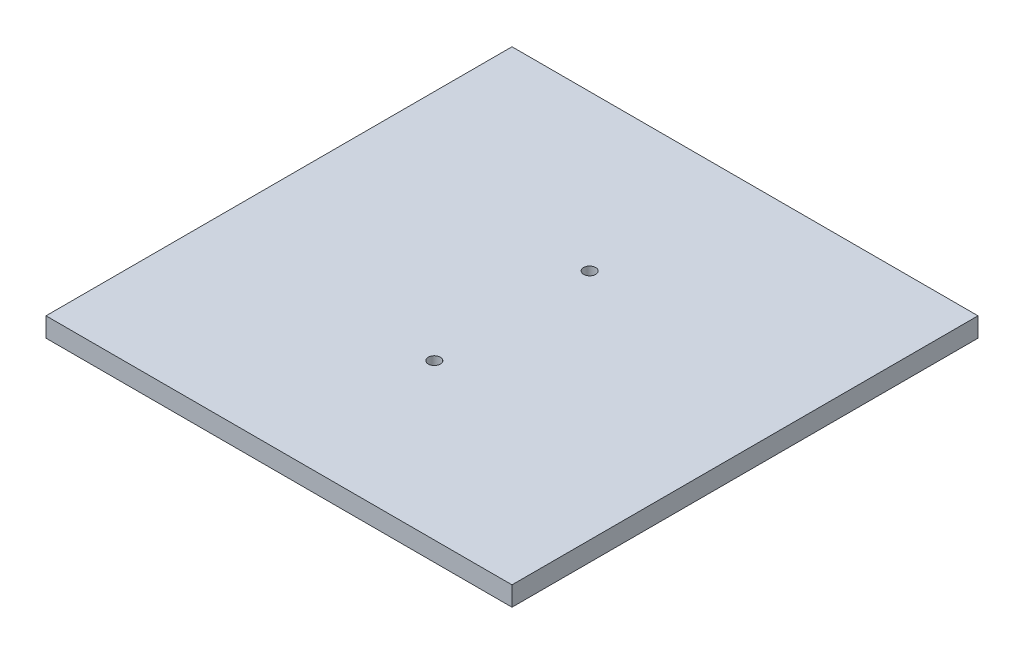
ISO-10303-21;
HEADER;
FILE_DESCRIPTION(('STEP AP214'),'2;1');
FILE_NAME('part.step','',(''),(''),'','','');
FILE_SCHEMA(('AUTOMOTIVE_DESIGN { 1 0 10303 214 1 1 1 1 }'));
ENDSEC;
DATA;
#1=APPLICATION_CONTEXT('core data for automotive mechanical design processes');
#2=APPLICATION_PROTOCOL_DEFINITION('international standard','automotive_design',2000,#1);
#3=PRODUCT_CONTEXT('',#1,'mechanical');
#4=PRODUCT('Part','Part','',(#3));
#5=PRODUCT_RELATED_PRODUCT_CATEGORY('part','',(#4));
#6=PRODUCT_DEFINITION_FORMATION('','',#4);
#7=PRODUCT_DEFINITION_CONTEXT('part definition',#1,'design');
#8=PRODUCT_DEFINITION('design','',#6,#7);
#9=PRODUCT_DEFINITION_SHAPE('','',#8);
#10=(LENGTH_UNIT() NAMED_UNIT(*) SI_UNIT(.MILLI.,.METRE.));
#11=(NAMED_UNIT(*) PLANE_ANGLE_UNIT() SI_UNIT($,.RADIAN.));
#12=(NAMED_UNIT(*) SI_UNIT($,.STERADIAN.) SOLID_ANGLE_UNIT());
#13=UNCERTAINTY_MEASURE_WITH_UNIT(LENGTH_MEASURE(1.E-05),#10,'distance_accuracy_value','');
#14=(GEOMETRIC_REPRESENTATION_CONTEXT(3) GLOBAL_UNCERTAINTY_ASSIGNED_CONTEXT((#13)) GLOBAL_UNIT_ASSIGNED_CONTEXT((#10,
#11,#12)) REPRESENTATION_CONTEXT('',''));
#15=CARTESIAN_POINT('',(0.,0.,0.));
#16=DIRECTION('',(0.,0.,1.));
#17=DIRECTION('',(1.,0.,0.));
#18=AXIS2_PLACEMENT_3D('',#15,#16,#17);
#19=CARTESIAN_POINT('',(-47.6798143851508,5.,40.2320185614849));
#20=DIRECTION('',(1.,0.,0.));
#21=DIRECTION('',(0.,0.,-1.));
#22=AXIS2_PLACEMENT_3D('',#19,#20,#21);
#23=PLANE('',#22);
#24=DIRECTION('',(0.,0.,1.));
#25=VECTOR('',#24,1.);
#26=CARTESIAN_POINT('',(-47.6798143851508,0.,40.2320185614849));
#27=LINE('',#26,#25);
#28=CARTESIAN_POINT('',(-47.6798143851508,0.,-79.7679814385151));
#29=VERTEX_POINT('',#28);
#30=CARTESIAN_POINT('',(-47.6798143851508,0.,40.2320185614849));
#31=VERTEX_POINT('',#30);
#32=EDGE_CURVE('E107',#29,#31,#27,.T.);
#33=ORIENTED_EDGE('',*,*,#32,.T.);
#34=DIRECTION('',(0.,-1.,0.));
#35=VECTOR('',#34,1.);
#36=CARTESIAN_POINT('',(-47.6798143851508,5.,40.2320185614849));
#37=LINE('',#36,#35);
#38=CARTESIAN_POINT('',(-47.6798143851508,5.,40.2320185614849));
#39=VERTEX_POINT('',#38);
#40=EDGE_CURVE('E11',#39,#31,#37,.T.);
#41=ORIENTED_EDGE('',*,*,#40,.F.);
#42=DIRECTION('',(0.,0.,1.));
#43=VECTOR('',#42,1.);
#44=CARTESIAN_POINT('',(-47.6798143851508,5.,40.2320185614849));
#45=LINE('',#44,#43);
#46=CARTESIAN_POINT('',(-47.6798143851508,5.,-79.7679814385151));
#47=VERTEX_POINT('',#46);
#48=EDGE_CURVE('E91',#47,#39,#45,.T.);
#49=ORIENTED_EDGE('',*,*,#48,.F.);
#50=DIRECTION('',(0.,-1.,0.));
#51=VECTOR('',#50,1.);
#52=CARTESIAN_POINT('',(-47.6798143851508,5.,-79.7679814385151));
#53=LINE('',#52,#51);
#54=EDGE_CURVE('E103',#47,#29,#53,.T.);
#55=ORIENTED_EDGE('',*,*,#54,.T.);
#56=EDGE_LOOP('',(#33,#41,#49,#55));
#57=FACE_BOUND('',#56,.T.);
#58=ADVANCED_FACE('F39',(#57),#23,.F.);
#59=CARTESIAN_POINT('',(-47.6798143851508,5.,40.2320185614849));
#60=DIRECTION('',(0.,0.,-1.));
#61=DIRECTION('',(-1.,0.,0.));
#62=AXIS2_PLACEMENT_3D('',#59,#60,#61);
#63=PLANE('',#62);
#64=DIRECTION('',(1.,0.,0.));
#65=VECTOR('',#64,1.);
#66=CARTESIAN_POINT('',(-47.6798143851508,0.,40.2320185614849));
#67=LINE('',#66,#65);
#68=CARTESIAN_POINT('',(72.3201856148492,0.,40.2320185614849));
#69=VERTEX_POINT('',#68);
#70=EDGE_CURVE('E96',#31,#69,#67,.T.);
#71=ORIENTED_EDGE('',*,*,#70,.T.);
#72=DIRECTION('',(0.,-1.,0.));
#73=VECTOR('',#72,1.);
#74=CARTESIAN_POINT('',(72.3201856148492,5.,40.2320185614849));
#75=LINE('',#74,#73);
#76=CARTESIAN_POINT('',(72.3201856148492,5.,40.2320185614849));
#77=VERTEX_POINT('',#76);
#78=EDGE_CURVE('E48',#77,#69,#75,.T.);
#79=ORIENTED_EDGE('',*,*,#78,.F.);
#80=DIRECTION('',(1.,0.,0.));
#81=VECTOR('',#80,1.);
#82=CARTESIAN_POINT('',(-47.6798143851508,5.,40.2320185614849));
#83=LINE('',#82,#81);
#84=EDGE_CURVE('E86',#39,#77,#83,.T.);
#85=ORIENTED_EDGE('',*,*,#84,.F.);
#86=ORIENTED_EDGE('',*,*,#40,.T.);
#87=EDGE_LOOP('',(#71,#79,#85,#86));
#88=FACE_BOUND('',#87,.T.);
#89=ADVANCED_FACE('F95',(#88),#63,.F.);
#90=CARTESIAN_POINT('',(72.3201856148492,5.,40.2320185614849));
#91=DIRECTION('',(-1.,0.,0.));
#92=DIRECTION('',(0.,0.,1.));
#93=AXIS2_PLACEMENT_3D('',#90,#91,#92);
#94=PLANE('',#93);
#95=DIRECTION('',(0.,0.,-1.));
#96=VECTOR('',#95,1.);
#97=CARTESIAN_POINT('',(72.3201856148492,0.,40.2320185614849));
#98=LINE('',#97,#96);
#99=CARTESIAN_POINT('',(72.3201856148492,0.,-79.7679814385151));
#100=VERTEX_POINT('',#99);
#101=EDGE_CURVE('E73',#69,#100,#98,.T.);
#102=ORIENTED_EDGE('',*,*,#101,.T.);
#103=DIRECTION('',(0.,-1.,0.));
#104=VECTOR('',#103,1.);
#105=CARTESIAN_POINT('',(72.3201856148492,5.,-79.7679814385151));
#106=LINE('',#105,#104);
#107=CARTESIAN_POINT('',(72.3201856148492,5.,-79.7679814385151));
#108=VERTEX_POINT('',#107);
#109=EDGE_CURVE('E98',#108,#100,#106,.T.);
#110=ORIENTED_EDGE('',*,*,#109,.F.);
#111=DIRECTION('',(0.,0.,-1.));
#112=VECTOR('',#111,1.);
#113=CARTESIAN_POINT('',(72.3201856148492,5.,40.2320185614849));
#114=LINE('',#113,#112);
#115=EDGE_CURVE('E89',#77,#108,#114,.T.);
#116=ORIENTED_EDGE('',*,*,#115,.F.);
#117=ORIENTED_EDGE('',*,*,#78,.T.);
#118=EDGE_LOOP('',(#102,#110,#116,#117));
#119=FACE_BOUND('',#118,.T.);
#120=ADVANCED_FACE('F99',(#119),#94,.F.);
#121=CARTESIAN_POINT('',(-47.6798143851508,5.,-79.7679814385151));
#122=DIRECTION('',(0.,0.,1.));
#123=DIRECTION('',(1.,0.,0.));
#124=AXIS2_PLACEMENT_3D('',#121,#122,#123);
#125=PLANE('',#124);
#126=DIRECTION('',(-1.,0.,0.));
#127=VECTOR('',#126,1.);
#128=CARTESIAN_POINT('',(-47.6798143851508,0.,-79.7679814385151));
#129=LINE('',#128,#127);
#130=EDGE_CURVE('E79',#100,#29,#129,.T.);
#131=ORIENTED_EDGE('',*,*,#130,.T.);
#132=ORIENTED_EDGE('',*,*,#54,.F.);
#133=DIRECTION('',(-1.,0.,0.));
#134=VECTOR('',#133,1.);
#135=CARTESIAN_POINT('',(-47.6798143851508,5.,-79.7679814385151));
#136=LINE('',#135,#134);
#137=EDGE_CURVE('E56',#108,#47,#136,.T.);
#138=ORIENTED_EDGE('',*,*,#137,.F.);
#139=ORIENTED_EDGE('',*,*,#109,.T.);
#140=EDGE_LOOP('',(#131,#132,#138,#139));
#141=FACE_BOUND('',#140,.T.);
#142=ADVANCED_FACE('F121',(#141),#125,.F.);
#143=CARTESIAN_POINT('',(0.,5.,0.));
#144=DIRECTION('',(0.,-1.,0.));
#145=DIRECTION('',(0.,0.,-1.));
#146=AXIS2_PLACEMENT_3D('',#143,#144,#145);
#147=PLANE('',#146);
#148=CARTESIAN_POINT('',(12.3201856148492,5.,0.232018561484925));
#149=DIRECTION('',(0.,-1.,0.));
#150=DIRECTION('',(0.,0.,-1.));
#151=AXIS2_PLACEMENT_3D('',#148,#149,#150);
#152=CIRCLE('',#151,1.55);
#153=CARTESIAN_POINT('',(12.3201856148492,5.,-1.31798143851507));
#154=VERTEX_POINT('',#153);
#155=EDGE_CURVE('E135',#154,#154,#152,.T.);
#156=ORIENTED_EDGE('',*,*,#155,.T.);
#157=EDGE_LOOP('',(#156));
#158=FACE_BOUND('',#157,.T.);
#159=CARTESIAN_POINT('',(12.3201856148492,5.,-39.7679814385151));
#160=DIRECTION('',(0.,-1.,0.));
#161=DIRECTION('',(0.,0.,-1.));
#162=AXIS2_PLACEMENT_3D('',#159,#160,#161);
#163=CIRCLE('',#162,1.55);
#164=CARTESIAN_POINT('',(12.3201856148492,5.,-41.3179814385151));
#165=VERTEX_POINT('',#164);
#166=EDGE_CURVE('E111',#165,#165,#163,.T.);
#167=ORIENTED_EDGE('',*,*,#166,.T.);
#168=EDGE_LOOP('',(#167));
#169=FACE_BOUND('',#168,.T.);
#170=ORIENTED_EDGE('',*,*,#48,.T.);
#171=ORIENTED_EDGE('',*,*,#84,.T.);
#172=ORIENTED_EDGE('',*,*,#115,.T.);
#173=ORIENTED_EDGE('',*,*,#137,.T.);
#174=EDGE_LOOP('',(#170,#171,#172,#173));
#175=FACE_BOUND('',#174,.T.);
#176=ADVANCED_FACE('F87',(#158,#169,#175),#147,.F.);
#177=CARTESIAN_POINT('',(0.,0.,0.));
#178=DIRECTION('',(0.,-1.,0.));
#179=DIRECTION('',(0.,0.,-1.));
#180=AXIS2_PLACEMENT_3D('',#177,#178,#179);
#181=PLANE('',#180);
#182=CARTESIAN_POINT('',(12.3201856148492,0.,0.232018561484925));
#183=DIRECTION('',(0.,-1.,0.));
#184=DIRECTION('',(0.,0.,-1.));
#185=AXIS2_PLACEMENT_3D('',#182,#183,#184);
#186=CIRCLE('',#185,1.55);
#187=CARTESIAN_POINT('',(12.3201856148492,0.,-1.31798143851507));
#188=VERTEX_POINT('',#187);
#189=EDGE_CURVE('E139',#188,#188,#186,.T.);
#190=ORIENTED_EDGE('',*,*,#189,.F.);
#191=EDGE_LOOP('',(#190));
#192=FACE_BOUND('',#191,.T.);
#193=CARTESIAN_POINT('',(12.3201856148492,0.,-39.7679814385151));
#194=DIRECTION('',(0.,-1.,0.));
#195=DIRECTION('',(0.,0.,-1.));
#196=AXIS2_PLACEMENT_3D('',#193,#194,#195);
#197=CIRCLE('',#196,1.55);
#198=CARTESIAN_POINT('',(12.3201856148492,0.,-41.3179814385151));
#199=VERTEX_POINT('',#198);
#200=EDGE_CURVE('E131',#199,#199,#197,.T.);
#201=ORIENTED_EDGE('',*,*,#200,.F.);
#202=EDGE_LOOP('',(#201));
#203=FACE_BOUND('',#202,.T.);
#204=ORIENTED_EDGE('',*,*,#32,.F.);
#205=ORIENTED_EDGE('',*,*,#130,.F.);
#206=ORIENTED_EDGE('',*,*,#101,.F.);
#207=ORIENTED_EDGE('',*,*,#70,.F.);
#208=EDGE_LOOP('',(#204,#205,#206,#207));
#209=FACE_BOUND('',#208,.T.);
#210=ADVANCED_FACE('F124',(#192,#203,#209),#181,.T.);
#211=CARTESIAN_POINT('',(12.3201856148492,0.,-39.7679814385151));
#212=DIRECTION('',(0.,-1.,0.));
#213=DIRECTION('',(0.,0.,-1.));
#214=AXIS2_PLACEMENT_3D('',#211,#212,#213);
#215=CYLINDRICAL_SURFACE('',#214,1.55);
#216=ORIENTED_EDGE('',*,*,#166,.F.);
#217=EDGE_LOOP('',(#216));
#218=FACE_BOUND('',#217,.T.);
#219=ORIENTED_EDGE('',*,*,#200,.T.);
#220=EDGE_LOOP('',(#219));
#221=FACE_BOUND('',#220,.T.);
#222=ADVANCED_FACE('F148',(#218,#221),#215,.F.);
#223=CARTESIAN_POINT('',(12.3201856148492,0.,0.232018561484925));
#224=DIRECTION('',(0.,-1.,0.));
#225=DIRECTION('',(0.,0.,-1.));
#226=AXIS2_PLACEMENT_3D('',#223,#224,#225);
#227=CYLINDRICAL_SURFACE('',#226,1.55);
#228=ORIENTED_EDGE('',*,*,#155,.F.);
#229=EDGE_LOOP('',(#228));
#230=FACE_BOUND('',#229,.T.);
#231=ORIENTED_EDGE('',*,*,#189,.T.);
#232=EDGE_LOOP('',(#231));
#233=FACE_BOUND('',#232,.T.);
#234=ADVANCED_FACE('F144',(#230,#233),#227,.F.);
#235=CLOSED_SHELL('',(#58,#89,#120,#142,#176,#210,#222,#234));
#236=MANIFOLD_SOLID_BREP('B2',#235);
#237=ADVANCED_BREP_SHAPE_REPRESENTATION('',(#18,#236),#14);
#238=SHAPE_DEFINITION_REPRESENTATION(#9,#237);
ENDSEC;
END-ISO-10303-21;
